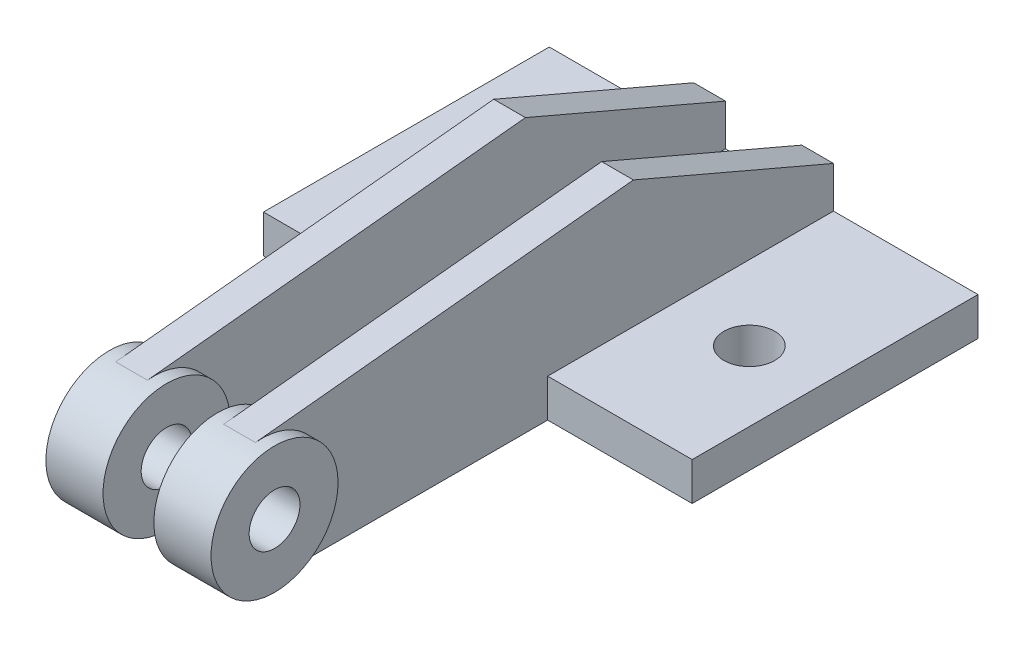
ISO-10303-21;
HEADER;
FILE_DESCRIPTION(('STEP AP214'),'2;1');
FILE_NAME('part.step','',(''),(''),'','','');
FILE_SCHEMA(('AUTOMOTIVE_DESIGN { 1 0 10303 214 1 1 1 1 }'));
ENDSEC;
DATA;
#1=APPLICATION_CONTEXT('core data for automotive mechanical design processes');
#2=APPLICATION_PROTOCOL_DEFINITION('international standard','automotive_design',2000,#1);
#3=PRODUCT_CONTEXT('',#1,'mechanical');
#4=PRODUCT('Part','Part','',(#3));
#5=PRODUCT_RELATED_PRODUCT_CATEGORY('part','',(#4));
#6=PRODUCT_DEFINITION_FORMATION('','',#4);
#7=PRODUCT_DEFINITION_CONTEXT('part definition',#1,'design');
#8=PRODUCT_DEFINITION('design','',#6,#7);
#9=PRODUCT_DEFINITION_SHAPE('','',#8);
#10=(LENGTH_UNIT() NAMED_UNIT(*) SI_UNIT(.MILLI.,.METRE.));
#11=(NAMED_UNIT(*) PLANE_ANGLE_UNIT() SI_UNIT($,.RADIAN.));
#12=(NAMED_UNIT(*) SI_UNIT($,.STERADIAN.) SOLID_ANGLE_UNIT());
#13=UNCERTAINTY_MEASURE_WITH_UNIT(LENGTH_MEASURE(1.E-05),#10,'distance_accuracy_value','');
#14=(GEOMETRIC_REPRESENTATION_CONTEXT(3) GLOBAL_UNCERTAINTY_ASSIGNED_CONTEXT((#13)) GLOBAL_UNIT_ASSIGNED_CONTEXT((#10,
#11,#12)) REPRESENTATION_CONTEXT('',''));
#15=CARTESIAN_POINT('',(0.,0.,0.));
#16=DIRECTION('',(0.,0.,1.));
#17=DIRECTION('',(1.,0.,0.));
#18=AXIS2_PLACEMENT_3D('',#15,#16,#17);
#19=CARTESIAN_POINT('',(-22.,20.,90.));
#20=DIRECTION('',(-1.,0.,0.));
#21=DIRECTION('',(0.,0.,-1.));
#22=AXIS2_PLACEMENT_3D('',#19,#20,#21);
#23=PLANE('',#22);
#24=DIRECTION('',(0.,0.,-1.));
#25=VECTOR('',#24,1.);
#26=CARTESIAN_POINT('',(-22.,0.,0.));
#27=LINE('',#26,#25);
#28=CARTESIAN_POINT('',(-22.,0.,90.));
#29=VERTEX_POINT('',#28);
#30=CARTESIAN_POINT('',(-22.,0.,0.));
#31=VERTEX_POINT('',#30);
#32=EDGE_CURVE('E401',#29,#31,#27,.T.);
#33=ORIENTED_EDGE('',*,*,#32,.F.);
#34=CARTESIAN_POINT('',(-22.,20.,90.));
#35=DIRECTION('',(-1.,0.,0.));
#36=DIRECTION('',(0.,0.,1.));
#37=AXIS2_PLACEMENT_3D('',#34,#35,#36);
#38=CIRCLE('',#37,20.);
#39=CARTESIAN_POINT('',(-22.,39.8974012712608,92.0232208605158));
#40=VERTEX_POINT('',#39);
#41=EDGE_CURVE('E191',#29,#40,#38,.F.);
#42=ORIENTED_EDGE('',*,*,#41,.T.);
#43=DIRECTION('',(0.,-0.10116104302579,0.994870063563043));
#44=VECTOR('',#43,1.);
#45=CARTESIAN_POINT('',(-22.,52.,-27.));
#46=LINE('',#45,#44);
#47=CARTESIAN_POINT('',(-22.,52.,-27.));
#48=VERTEX_POINT('',#47);
#49=EDGE_CURVE('E397',#48,#40,#46,.T.);
#50=ORIENTED_EDGE('',*,*,#49,.F.);
#51=DIRECTION('',(0.,0.393919298579168,0.919145030018058));
#52=VECTOR('',#51,1.);
#53=CARTESIAN_POINT('',(-22.,25.,-90.));
#54=LINE('',#53,#52);
#55=CARTESIAN_POINT('',(-22.,25.,-90.));
#56=VERTEX_POINT('',#55);
#57=EDGE_CURVE('E215',#56,#48,#54,.T.);
#58=ORIENTED_EDGE('',*,*,#57,.F.);
#59=DIRECTION('',(0.,1.,0.));
#60=VECTOR('',#59,1.);
#61=CARTESIAN_POINT('',(-22.,12.,-90.));
#62=LINE('',#61,#60);
#63=CARTESIAN_POINT('',(-22.,12.,-90.));
#64=VERTEX_POINT('',#63);
#65=EDGE_CURVE('E207',#64,#56,#62,.T.);
#66=ORIENTED_EDGE('',*,*,#65,.F.);
#67=DIRECTION('',(0.,0.,-1.));
#68=VECTOR('',#67,1.);
#69=CARTESIAN_POINT('',(-22.,12.,-90.));
#70=LINE('',#69,#68);
#71=CARTESIAN_POINT('',(-22.,12.,0.));
#72=VERTEX_POINT('',#71);
#73=EDGE_CURVE('E374',#72,#64,#70,.T.);
#74=ORIENTED_EDGE('',*,*,#73,.F.);
#75=DIRECTION('',(0.,1.,0.));
#76=VECTOR('',#75,1.);
#77=CARTESIAN_POINT('',(-22.,12.,0.));
#78=LINE('',#77,#76);
#79=EDGE_CURVE('E61',#31,#72,#78,.T.);
#80=ORIENTED_EDGE('',*,*,#79,.F.);
#81=EDGE_LOOP('',(#33,#42,#50,#58,#66,#74,#80));
#82=FACE_BOUND('',#81,.T.);
#83=ADVANCED_FACE('F45',(#82),#23,.T.);
#84=CARTESIAN_POINT('',(-12.,20.,90.));
#85=DIRECTION('',(-1.,0.,0.));
#86=DIRECTION('',(0.,0.,-1.));
#87=AXIS2_PLACEMENT_3D('',#84,#85,#86);
#88=PLANE('',#87);
#89=CARTESIAN_POINT('',(-12.,20.,90.));
#90=DIRECTION('',(-1.,0.,0.));
#91=DIRECTION('',(0.,0.,1.));
#92=AXIS2_PLACEMENT_3D('',#89,#90,#91);
#93=CIRCLE('',#92,20.);
#94=CARTESIAN_POINT('',(-12.,0.,90.));
#95=VERTEX_POINT('',#94);
#96=CARTESIAN_POINT('',(-12.,39.8974012712609,92.0232208605158));
#97=VERTEX_POINT('',#96);
#98=EDGE_CURVE('E11',#95,#97,#93,.F.);
#99=ORIENTED_EDGE('',*,*,#98,.F.);
#100=DIRECTION('',(0.,0.,-1.));
#101=VECTOR('',#100,1.);
#102=CARTESIAN_POINT('',(-12.,0.,0.));
#103=LINE('',#102,#101);
#104=CARTESIAN_POINT('',(-12.,0.,0.));
#105=VERTEX_POINT('',#104);
#106=EDGE_CURVE('E172',#95,#105,#103,.T.);
#107=ORIENTED_EDGE('',*,*,#106,.T.);
#108=DIRECTION('',(0.,1.,0.));
#109=VECTOR('',#108,1.);
#110=CARTESIAN_POINT('',(-12.,12.,0.));
#111=LINE('',#110,#109);
#112=CARTESIAN_POINT('',(-12.,12.,0.));
#113=VERTEX_POINT('',#112);
#114=EDGE_CURVE('E185',#105,#113,#111,.T.);
#115=ORIENTED_EDGE('',*,*,#114,.T.);
#116=DIRECTION('',(0.,0.,-1.));
#117=VECTOR('',#116,1.);
#118=CARTESIAN_POINT('',(-12.,12.,-90.));
#119=LINE('',#118,#117);
#120=CARTESIAN_POINT('',(-12.,12.,-90.));
#121=VERTEX_POINT('',#120);
#122=EDGE_CURVE('E69',#113,#121,#119,.T.);
#123=ORIENTED_EDGE('',*,*,#122,.T.);
#124=DIRECTION('',(0.,1.,0.));
#125=VECTOR('',#124,1.);
#126=CARTESIAN_POINT('',(-12.,12.,-90.));
#127=LINE('',#126,#125);
#128=CARTESIAN_POINT('',(-12.,25.,-90.));
#129=VERTEX_POINT('',#128);
#130=EDGE_CURVE('E365',#121,#129,#127,.T.);
#131=ORIENTED_EDGE('',*,*,#130,.T.);
#132=DIRECTION('',(0.,0.393919298579168,0.919145030018058));
#133=VECTOR('',#132,1.);
#134=CARTESIAN_POINT('',(-12.,25.,-90.));
#135=LINE('',#134,#133);
#136=CARTESIAN_POINT('',(-12.,52.,-27.));
#137=VERTEX_POINT('',#136);
#138=EDGE_CURVE('E202',#129,#137,#135,.T.);
#139=ORIENTED_EDGE('',*,*,#138,.T.);
#140=DIRECTION('',(0.,-0.10116104302579,0.994870063563043));
#141=VECTOR('',#140,1.);
#142=CARTESIAN_POINT('',(-12.,52.,-27.));
#143=LINE('',#142,#141);
#144=EDGE_CURVE('E184',#137,#97,#143,.T.);
#145=ORIENTED_EDGE('',*,*,#144,.T.);
#146=EDGE_LOOP('',(#99,#107,#115,#123,#131,#139,#145));
#147=FACE_BOUND('',#146,.T.);
#148=ADVANCED_FACE('F197',(#147),#88,.F.);
#149=CARTESIAN_POINT('',(67.5,0.,0.));
#150=DIRECTION('',(0.,0.,-1.));
#151=DIRECTION('',(-1.,0.,0.));
#152=AXIS2_PLACEMENT_3D('',#149,#150,#151);
#153=PLANE('',#152);
#154=ORIENTED_EDGE('',*,*,#114,.F.);
#155=DIRECTION('',(-1.,0.,0.));
#156=VECTOR('',#155,1.);
#157=CARTESIAN_POINT('',(67.5,0.,0.));
#158=LINE('',#157,#156);
#159=CARTESIAN_POINT('',(12.,0.,0.));
#160=VERTEX_POINT('',#159);
#161=EDGE_CURVE('E179',#160,#105,#158,.T.);
#162=ORIENTED_EDGE('',*,*,#161,.F.);
#163=DIRECTION('',(0.,1.,0.));
#164=VECTOR('',#163,1.);
#165=CARTESIAN_POINT('',(12.,12.,0.));
#166=LINE('',#165,#164);
#167=CARTESIAN_POINT('',(12.,12.,0.));
#168=VERTEX_POINT('',#167);
#169=EDGE_CURVE('E270',#160,#168,#166,.T.);
#170=ORIENTED_EDGE('',*,*,#169,.T.);
#171=DIRECTION('',(-1.,0.,0.));
#172=VECTOR('',#171,1.);
#173=CARTESIAN_POINT('',(67.5,12.,0.));
#174=LINE('',#173,#172);
#175=EDGE_CURVE('E325',#168,#113,#174,.T.);
#176=ORIENTED_EDGE('',*,*,#175,.T.);
#177=EDGE_LOOP('',(#154,#162,#170,#176));
#178=FACE_BOUND('',#177,.T.);
#179=ADVANCED_FACE('F387',(#178),#153,.F.);
#180=CARTESIAN_POINT('',(67.5,12.,0.));
#181=DIRECTION('',(0.,-1.,0.));
#182=DIRECTION('',(0.,0.,-1.));
#183=AXIS2_PLACEMENT_3D('',#180,#181,#182);
#184=PLANE('',#183);
#185=ORIENTED_EDGE('',*,*,#122,.F.);
#186=ORIENTED_EDGE('',*,*,#175,.F.);
#187=DIRECTION('',(0.,0.,-1.));
#188=VECTOR('',#187,1.);
#189=CARTESIAN_POINT('',(12.,12.,-90.));
#190=LINE('',#189,#188);
#191=CARTESIAN_POINT('',(12.,12.,-90.));
#192=VERTEX_POINT('',#191);
#193=EDGE_CURVE('E237',#168,#192,#190,.T.);
#194=ORIENTED_EDGE('',*,*,#193,.T.);
#195=DIRECTION('',(-1.,0.,0.));
#196=VECTOR('',#195,1.);
#197=CARTESIAN_POINT('',(67.5,12.,-90.));
#198=LINE('',#197,#196);
#199=EDGE_CURVE('E330',#192,#121,#198,.T.);
#200=ORIENTED_EDGE('',*,*,#199,.T.);
#201=EDGE_LOOP('',(#185,#186,#194,#200));
#202=FACE_BOUND('',#201,.T.);
#203=ADVANCED_FACE('F458',(#202),#184,.F.);
#204=CARTESIAN_POINT('',(-67.5,0.,0.));
#205=VERTEX_POINT('',#204);
#206=EDGE_CURVE('E334',#31,#205,#158,.T.);
#207=ORIENTED_EDGE('',*,*,#206,.F.);
#208=ORIENTED_EDGE('',*,*,#79,.T.);
#209=CARTESIAN_POINT('',(-67.5,12.,0.));
#210=VERTEX_POINT('',#209);
#211=EDGE_CURVE('E306',#72,#210,#174,.T.);
#212=ORIENTED_EDGE('',*,*,#211,.T.);
#213=DIRECTION('',(0.,-1.,0.));
#214=VECTOR('',#213,1.);
#215=CARTESIAN_POINT('',(-67.5,0.,0.));
#216=LINE('',#215,#214);
#217=EDGE_CURVE('E291',#210,#205,#216,.T.);
#218=ORIENTED_EDGE('',*,*,#217,.T.);
#219=EDGE_LOOP('',(#207,#208,#212,#218));
#220=FACE_BOUND('',#219,.T.);
#221=ADVANCED_FACE('F383',(#220),#153,.F.);
#222=CARTESIAN_POINT('',(-45.5,12.,-40.));
#223=DIRECTION('',(0.,1.,0.));
#224=DIRECTION('',(0.,0.,1.));
#225=AXIS2_PLACEMENT_3D('',#222,#223,#224);
#226=CIRCLE('',#225,8.00000000000001);
#227=CARTESIAN_POINT('',(-45.5,12.,-32.));
#228=VERTEX_POINT('',#227);
#229=EDGE_CURVE('E448',#228,#228,#226,.T.);
#230=ORIENTED_EDGE('',*,*,#229,.F.);
#231=EDGE_LOOP('',(#230));
#232=FACE_BOUND('',#231,.T.);
#233=ORIENTED_EDGE('',*,*,#211,.F.);
#234=ORIENTED_EDGE('',*,*,#73,.T.);
#235=CARTESIAN_POINT('',(-67.5,12.,-90.));
#236=VERTEX_POINT('',#235);
#237=EDGE_CURVE('E324',#64,#236,#198,.T.);
#238=ORIENTED_EDGE('',*,*,#237,.T.);
#239=DIRECTION('',(0.,0.,1.));
#240=VECTOR('',#239,1.);
#241=CARTESIAN_POINT('',(-67.5,12.,0.));
#242=LINE('',#241,#240);
#243=EDGE_CURVE('E297',#236,#210,#242,.T.);
#244=ORIENTED_EDGE('',*,*,#243,.T.);
#245=EDGE_LOOP('',(#233,#234,#238,#244));
#246=FACE_BOUND('',#245,.T.);
#247=ADVANCED_FACE('F370',(#232,#246),#184,.F.);
#248=CARTESIAN_POINT('',(67.5,12.,0.));
#249=VERTEX_POINT('',#248);
#250=CARTESIAN_POINT('',(22.,12.,0.));
#251=VERTEX_POINT('',#250);
#252=EDGE_CURVE('E320',#249,#251,#174,.T.);
#253=ORIENTED_EDGE('',*,*,#252,.T.);
#254=DIRECTION('',(0.,1.,0.));
#255=VECTOR('',#254,1.);
#256=CARTESIAN_POINT('',(22.,12.,0.));
#257=LINE('',#256,#255);
#258=CARTESIAN_POINT('',(22.,0.,0.));
#259=VERTEX_POINT('',#258);
#260=EDGE_CURVE('E248',#259,#251,#257,.T.);
#261=ORIENTED_EDGE('',*,*,#260,.F.);
#262=CARTESIAN_POINT('',(67.5,0.,0.));
#263=VERTEX_POINT('',#262);
#264=EDGE_CURVE('E335',#263,#259,#158,.T.);
#265=ORIENTED_EDGE('',*,*,#264,.F.);
#266=DIRECTION('',(0.,-1.,0.));
#267=VECTOR('',#266,1.);
#268=CARTESIAN_POINT('',(67.5,0.,0.));
#269=LINE('',#268,#267);
#270=EDGE_CURVE('E292',#249,#263,#269,.T.);
#271=ORIENTED_EDGE('',*,*,#270,.F.);
#272=EDGE_LOOP('',(#253,#261,#265,#271));
#273=FACE_BOUND('',#272,.T.);
#274=ADVANCED_FACE('F47',(#273),#153,.F.);
#275=CARTESIAN_POINT('',(67.5,0.,0.));
#276=DIRECTION('',(0.,1.,0.));
#277=DIRECTION('',(0.,0.,1.));
#278=AXIS2_PLACEMENT_3D('',#275,#276,#277);
#279=PLANE('',#278);
#280=CARTESIAN_POINT('',(-45.5,0.,-40.));
#281=DIRECTION('',(0.,1.,0.));
#282=DIRECTION('',(0.,0.,1.));
#283=AXIS2_PLACEMENT_3D('',#280,#281,#282);
#284=CIRCLE('',#283,8.00000000000001);
#285=CARTESIAN_POINT('',(-45.5,0.,-32.));
#286=VERTEX_POINT('',#285);
#287=EDGE_CURVE('E444',#286,#286,#284,.T.);
#288=ORIENTED_EDGE('',*,*,#287,.T.);
#289=EDGE_LOOP('',(#288));
#290=FACE_BOUND('',#289,.T.);
#291=CARTESIAN_POINT('',(45.5,0.,-40.));
#292=DIRECTION('',(0.,1.,0.));
#293=DIRECTION('',(0.,0.,1.));
#294=AXIS2_PLACEMENT_3D('',#291,#292,#293);
#295=CIRCLE('',#294,8.00000000000001);
#296=CARTESIAN_POINT('',(45.5,0.,-32.));
#297=VERTEX_POINT('',#296);
#298=EDGE_CURVE('E436',#297,#297,#295,.T.);
#299=ORIENTED_EDGE('',*,*,#298,.T.);
#300=EDGE_LOOP('',(#299));
#301=FACE_BOUND('',#300,.T.);
#302=DIRECTION('',(0.,0.,-1.));
#303=VECTOR('',#302,1.);
#304=CARTESIAN_POINT('',(-67.5,0.,0.));
#305=LINE('',#304,#303);
#306=CARTESIAN_POINT('',(-67.5,0.,-90.));
#307=VERTEX_POINT('',#306);
#308=EDGE_CURVE('E310',#205,#307,#305,.T.);
#309=ORIENTED_EDGE('',*,*,#308,.T.);
#310=DIRECTION('',(-1.,0.,0.));
#311=VECTOR('',#310,1.);
#312=CARTESIAN_POINT('',(67.5,0.,-90.));
#313=LINE('',#312,#311);
#314=CARTESIAN_POINT('',(67.5,0.,-90.));
#315=VERTEX_POINT('',#314);
#316=EDGE_CURVE('E329',#315,#307,#313,.T.);
#317=ORIENTED_EDGE('',*,*,#316,.F.);
#318=DIRECTION('',(0.,0.,-1.));
#319=VECTOR('',#318,1.);
#320=CARTESIAN_POINT('',(67.5,0.,0.));
#321=LINE('',#320,#319);
#322=EDGE_CURVE('E296',#263,#315,#321,.T.);
#323=ORIENTED_EDGE('',*,*,#322,.F.);
#324=ORIENTED_EDGE('',*,*,#264,.T.);
#325=DIRECTION('',(0.,0.,-1.));
#326=VECTOR('',#325,1.);
#327=CARTESIAN_POINT('',(22.,0.,0.));
#328=LINE('',#327,#326);
#329=CARTESIAN_POINT('',(22.,0.,90.));
#330=VERTEX_POINT('',#329);
#331=EDGE_CURVE('E244',#330,#259,#328,.T.);
#332=ORIENTED_EDGE('',*,*,#331,.F.);
#333=DIRECTION('',(-1.,0.,0.));
#334=VECTOR('',#333,1.);
#335=CARTESIAN_POINT('',(22.,0.,90.));
#336=LINE('',#335,#334);
#337=CARTESIAN_POINT('',(12.,0.,90.));
#338=VERTEX_POINT('',#337);
#339=EDGE_CURVE('E256',#330,#338,#336,.T.);
#340=ORIENTED_EDGE('',*,*,#339,.T.);
#341=DIRECTION('',(0.,0.,-1.));
#342=VECTOR('',#341,1.);
#343=CARTESIAN_POINT('',(12.,0.,0.));
#344=LINE('',#343,#342);
#345=EDGE_CURVE('E267',#338,#160,#344,.T.);
#346=ORIENTED_EDGE('',*,*,#345,.T.);
#347=ORIENTED_EDGE('',*,*,#161,.T.);
#348=ORIENTED_EDGE('',*,*,#106,.F.);
#349=DIRECTION('',(1.,0.,0.));
#350=VECTOR('',#349,1.);
#351=CARTESIAN_POINT('',(-22.,0.,90.));
#352=LINE('',#351,#350);
#353=EDGE_CURVE('E176',#29,#95,#352,.T.);
#354=ORIENTED_EDGE('',*,*,#353,.F.);
#355=ORIENTED_EDGE('',*,*,#32,.T.);
#356=ORIENTED_EDGE('',*,*,#206,.T.);
#357=EDGE_LOOP('',(#309,#317,#323,#324,#332,#340,#346,#347,#348,#354,#355,#356));
#358=FACE_BOUND('',#357,.T.);
#359=ADVANCED_FACE('F174',(#290,#301,#358),#279,.F.);
#360=CARTESIAN_POINT('',(67.5,0.,-90.));
#361=DIRECTION('',(0.,0.,1.));
#362=DIRECTION('',(1.,0.,0.));
#363=AXIS2_PLACEMENT_3D('',#360,#361,#362);
#364=PLANE('',#363);
#365=DIRECTION('',(0.,1.,0.));
#366=VECTOR('',#365,1.);
#367=CARTESIAN_POINT('',(-67.5,0.,-90.));
#368=LINE('',#367,#366);
#369=EDGE_CURVE('E313',#307,#236,#368,.T.);
#370=ORIENTED_EDGE('',*,*,#369,.T.);
#371=ORIENTED_EDGE('',*,*,#237,.F.);
#372=ORIENTED_EDGE('',*,*,#65,.T.);
#373=DIRECTION('',(1.,0.,0.));
#374=VECTOR('',#373,1.);
#375=CARTESIAN_POINT('',(-22.,25.,-90.));
#376=LINE('',#375,#374);
#377=EDGE_CURVE('E211',#56,#129,#376,.T.);
#378=ORIENTED_EDGE('',*,*,#377,.T.);
#379=ORIENTED_EDGE('',*,*,#130,.F.);
#380=ORIENTED_EDGE('',*,*,#199,.F.);
#381=DIRECTION('',(0.,1.,0.));
#382=VECTOR('',#381,1.);
#383=CARTESIAN_POINT('',(12.,12.,-90.));
#384=LINE('',#383,#382);
#385=CARTESIAN_POINT('',(12.,25.,-90.));
#386=VERTEX_POINT('',#385);
#387=EDGE_CURVE('E231',#192,#386,#384,.T.);
#388=ORIENTED_EDGE('',*,*,#387,.T.);
#389=DIRECTION('',(-1.,0.,0.));
#390=VECTOR('',#389,1.);
#391=CARTESIAN_POINT('',(22.,25.,-90.));
#392=LINE('',#391,#390);
#393=CARTESIAN_POINT('',(22.,25.,-90.));
#394=VERTEX_POINT('',#393);
#395=EDGE_CURVE('E287',#394,#386,#392,.T.);
#396=ORIENTED_EDGE('',*,*,#395,.F.);
#397=DIRECTION('',(0.,1.,0.));
#398=VECTOR('',#397,1.);
#399=CARTESIAN_POINT('',(22.,12.,-90.));
#400=LINE('',#399,#398);
#401=CARTESIAN_POINT('',(22.,12.,-90.));
#402=VERTEX_POINT('',#401);
#403=EDGE_CURVE('E232',#402,#394,#400,.T.);
#404=ORIENTED_EDGE('',*,*,#403,.F.);
#405=CARTESIAN_POINT('',(67.5,12.,-90.));
#406=VERTEX_POINT('',#405);
#407=EDGE_CURVE('E326',#406,#402,#198,.T.);
#408=ORIENTED_EDGE('',*,*,#407,.F.);
#409=DIRECTION('',(0.,1.,0.));
#410=VECTOR('',#409,1.);
#411=CARTESIAN_POINT('',(67.5,0.,-90.));
#412=LINE('',#411,#410);
#413=EDGE_CURVE('E300',#315,#406,#412,.T.);
#414=ORIENTED_EDGE('',*,*,#413,.F.);
#415=ORIENTED_EDGE('',*,*,#316,.T.);
#416=EDGE_LOOP('',(#370,#371,#372,#378,#379,#380,#388,#396,#404,#408,#414,#415));
#417=FACE_BOUND('',#416,.T.);
#418=ADVANCED_FACE('F363',(#417),#364,.F.);
#419=CARTESIAN_POINT('',(45.5,12.,-40.));
#420=DIRECTION('',(0.,1.,0.));
#421=DIRECTION('',(0.,0.,1.));
#422=AXIS2_PLACEMENT_3D('',#419,#420,#421);
#423=CIRCLE('',#422,8.00000000000001);
#424=CARTESIAN_POINT('',(45.5,12.,-32.));
#425=VERTEX_POINT('',#424);
#426=EDGE_CURVE('E440',#425,#425,#423,.T.);
#427=ORIENTED_EDGE('',*,*,#426,.F.);
#428=EDGE_LOOP('',(#427));
#429=FACE_BOUND('',#428,.T.);
#430=ORIENTED_EDGE('',*,*,#407,.T.);
#431=DIRECTION('',(0.,0.,-1.));
#432=VECTOR('',#431,1.);
#433=CARTESIAN_POINT('',(22.,12.,-90.));
#434=LINE('',#433,#432);
#435=EDGE_CURVE('E252',#251,#402,#434,.T.);
#436=ORIENTED_EDGE('',*,*,#435,.F.);
#437=ORIENTED_EDGE('',*,*,#252,.F.);
#438=DIRECTION('',(0.,0.,1.));
#439=VECTOR('',#438,1.);
#440=CARTESIAN_POINT('',(67.5,12.,0.));
#441=LINE('',#440,#439);
#442=EDGE_CURVE('E303',#406,#249,#441,.T.);
#443=ORIENTED_EDGE('',*,*,#442,.F.);
#444=EDGE_LOOP('',(#430,#436,#437,#443));
#445=FACE_BOUND('',#444,.T.);
#446=ADVANCED_FACE('F457',(#429,#445),#184,.F.);
#447=CARTESIAN_POINT('',(67.5,0.,0.));
#448=DIRECTION('',(-1.,0.,0.));
#449=DIRECTION('',(0.,0.,1.));
#450=AXIS2_PLACEMENT_3D('',#447,#448,#449);
#451=PLANE('',#450);
#452=ORIENTED_EDGE('',*,*,#270,.T.);
#453=ORIENTED_EDGE('',*,*,#322,.T.);
#454=ORIENTED_EDGE('',*,*,#413,.T.);
#455=ORIENTED_EDGE('',*,*,#442,.T.);
#456=EDGE_LOOP('',(#452,#453,#454,#455));
#457=FACE_BOUND('',#456,.T.);
#458=ADVANCED_FACE('F469',(#457),#451,.F.);
#459=CARTESIAN_POINT('',(-67.5,0.,0.));
#460=DIRECTION('',(-1.,0.,0.));
#461=DIRECTION('',(0.,0.,1.));
#462=AXIS2_PLACEMENT_3D('',#459,#460,#461);
#463=PLANE('',#462);
#464=ORIENTED_EDGE('',*,*,#217,.F.);
#465=ORIENTED_EDGE('',*,*,#243,.F.);
#466=ORIENTED_EDGE('',*,*,#369,.F.);
#467=ORIENTED_EDGE('',*,*,#308,.F.);
#468=EDGE_LOOP('',(#464,#465,#466,#467));
#469=FACE_BOUND('',#468,.T.);
#470=ADVANCED_FACE('F382',(#469),#463,.T.);
#471=CARTESIAN_POINT('',(22.,25.,-90.));
#472=DIRECTION('',(0.,-0.919145030018058,0.393919298579168));
#473=DIRECTION('',(0.,-0.393919298579168,-0.919145030018058));
#474=AXIS2_PLACEMENT_3D('',#471,#472,#473);
#475=PLANE('',#474);
#476=DIRECTION('',(0.,0.393919298579168,0.919145030018058));
#477=VECTOR('',#476,1.);
#478=CARTESIAN_POINT('',(12.,25.,-90.));
#479=LINE('',#478,#477);
#480=CARTESIAN_POINT('',(12.,52.,-27.));
#481=VERTEX_POINT('',#480);
#482=EDGE_CURVE('E260',#386,#481,#479,.T.);
#483=ORIENTED_EDGE('',*,*,#482,.T.);
#484=DIRECTION('',(-1.,0.,0.));
#485=VECTOR('',#484,1.);
#486=CARTESIAN_POINT('',(22.,52.,-27.));
#487=LINE('',#486,#485);
#488=CARTESIAN_POINT('',(22.,52.,-27.));
#489=VERTEX_POINT('',#488);
#490=EDGE_CURVE('E283',#489,#481,#487,.T.);
#491=ORIENTED_EDGE('',*,*,#490,.F.);
#492=DIRECTION('',(0.,0.393919298579168,0.919145030018058));
#493=VECTOR('',#492,1.);
#494=CARTESIAN_POINT('',(22.,25.,-90.));
#495=LINE('',#494,#493);
#496=EDGE_CURVE('E236',#394,#489,#495,.T.);
#497=ORIENTED_EDGE('',*,*,#496,.F.);
#498=ORIENTED_EDGE('',*,*,#395,.T.);
#499=EDGE_LOOP('',(#483,#491,#497,#498));
#500=FACE_BOUND('',#499,.T.);
#501=ADVANCED_FACE('F358',(#500),#475,.F.);
#502=CARTESIAN_POINT('',(22.,52.,-27.));
#503=DIRECTION('',(0.,-0.994870063563044,-0.10116104302579));
#504=DIRECTION('',(0.,0.10116104302579,-0.994870063563044));
#505=AXIS2_PLACEMENT_3D('',#502,#503,#504);
#506=PLANE('',#505);
#507=DIRECTION('',(0.,-0.10116104302579,0.994870063563043));
#508=VECTOR('',#507,1.);
#509=CARTESIAN_POINT('',(12.,52.,-27.));
#510=LINE('',#509,#508);
#511=CARTESIAN_POINT('',(12.,39.8974012712609,92.0232208605158));
#512=VERTEX_POINT('',#511);
#513=EDGE_CURVE('E263',#481,#512,#510,.T.);
#514=ORIENTED_EDGE('',*,*,#513,.T.);
#515=DIRECTION('',(-1.,0.,0.));
#516=VECTOR('',#515,1.);
#517=CARTESIAN_POINT('',(22.,39.8974012712609,92.0232208605158));
#518=LINE('',#517,#516);
#519=CARTESIAN_POINT('',(22.,39.8974012712608,92.0232208605158));
#520=VERTEX_POINT('',#519);
#521=EDGE_CURVE('E279',#520,#512,#518,.T.);
#522=ORIENTED_EDGE('',*,*,#521,.F.);
#523=DIRECTION('',(0.,-0.10116104302579,0.994870063563043));
#524=VECTOR('',#523,1.);
#525=CARTESIAN_POINT('',(22.,52.,-27.));
#526=LINE('',#525,#524);
#527=EDGE_CURVE('E240',#489,#520,#526,.T.);
#528=ORIENTED_EDGE('',*,*,#527,.F.);
#529=ORIENTED_EDGE('',*,*,#490,.T.);
#530=EDGE_LOOP('',(#514,#522,#528,#529));
#531=FACE_BOUND('',#530,.T.);
#532=ADVANCED_FACE('F347',(#531),#506,.F.);
#533=CARTESIAN_POINT('',(22.,20.,90.));
#534=DIRECTION('',(-1.,0.,0.));
#535=DIRECTION('',(0.,0.,1.));
#536=AXIS2_PLACEMENT_3D('',#533,#534,#535);
#537=CYLINDRICAL_SURFACE('',#536,20.);
#538=ORIENTED_EDGE('',*,*,#521,.T.);
#539=CARTESIAN_POINT('',(12.,20.,90.));
#540=DIRECTION('',(1.,0.,0.));
#541=DIRECTION('',(0.,0.,-1.));
#542=AXIS2_PLACEMENT_3D('',#539,#540,#541);
#543=CIRCLE('',#542,20.);
#544=EDGE_CURVE('E54',#338,#512,#543,.T.);
#545=ORIENTED_EDGE('',*,*,#544,.F.);
#546=ORIENTED_EDGE('',*,*,#339,.F.);
#547=CARTESIAN_POINT('',(22.,20.,90.));
#548=DIRECTION('',(1.,0.,0.));
#549=DIRECTION('',(0.,0.,-1.));
#550=AXIS2_PLACEMENT_3D('',#547,#548,#549);
#551=CIRCLE('',#550,20.);
#552=EDGE_CURVE('E227',#330,#520,#551,.T.);
#553=ORIENTED_EDGE('',*,*,#552,.T.);
#554=EDGE_LOOP('',(#538,#545,#546,#553));
#555=FACE_BOUND('',#554,.T.);
#556=CARTESIAN_POINT('',(8.,20.,90.));
#557=DIRECTION('',(1.,0.,0.));
#558=DIRECTION('',(0.,0.,-1.));
#559=AXIS2_PLACEMENT_3D('',#556,#557,#558);
#560=CIRCLE('',#559,20.);
#561=CARTESIAN_POINT('',(8.,20.,70.));
#562=VERTEX_POINT('',#561);
#563=EDGE_CURVE('E223',#562,#562,#560,.T.);
#564=ORIENTED_EDGE('',*,*,#563,.T.);
#565=EDGE_LOOP('',(#564));
#566=FACE_BOUND('',#565,.T.);
#567=CARTESIAN_POINT('',(26.,20.,90.));
#568=DIRECTION('',(1.,0.,0.));
#569=DIRECTION('',(0.,0.,-1.));
#570=AXIS2_PLACEMENT_3D('',#567,#568,#569);
#571=CIRCLE('',#570,20.);
#572=CARTESIAN_POINT('',(26.,20.,70.));
#573=VERTEX_POINT('',#572);
#574=EDGE_CURVE('E193',#573,#573,#571,.T.);
#575=ORIENTED_EDGE('',*,*,#574,.F.);
#576=EDGE_LOOP('',(#575));
#577=FACE_BOUND('',#576,.T.);
#578=ADVANCED_FACE('F350',(#555,#566,#577),#537,.T.);
#579=CARTESIAN_POINT('',(22.,20.,90.));
#580=DIRECTION('',(1.,0.,0.));
#581=DIRECTION('',(0.,0.,-1.));
#582=AXIS2_PLACEMENT_3D('',#579,#580,#581);
#583=PLANE('',#582);
#584=ORIENTED_EDGE('',*,*,#552,.F.);
#585=ORIENTED_EDGE('',*,*,#331,.T.);
#586=ORIENTED_EDGE('',*,*,#260,.T.);
#587=ORIENTED_EDGE('',*,*,#435,.T.);
#588=ORIENTED_EDGE('',*,*,#403,.T.);
#589=ORIENTED_EDGE('',*,*,#496,.T.);
#590=ORIENTED_EDGE('',*,*,#527,.T.);
#591=EDGE_LOOP('',(#584,#585,#586,#587,#588,#589,#590));
#592=FACE_BOUND('',#591,.T.);
#593=ADVANCED_FACE('F354',(#592),#583,.T.);
#594=CARTESIAN_POINT('',(12.,20.,90.));
#595=DIRECTION('',(1.,0.,0.));
#596=DIRECTION('',(0.,0.,-1.));
#597=AXIS2_PLACEMENT_3D('',#594,#595,#596);
#598=PLANE('',#597);
#599=ORIENTED_EDGE('',*,*,#345,.F.);
#600=ORIENTED_EDGE('',*,*,#544,.T.);
#601=ORIENTED_EDGE('',*,*,#513,.F.);
#602=ORIENTED_EDGE('',*,*,#482,.F.);
#603=ORIENTED_EDGE('',*,*,#387,.F.);
#604=ORIENTED_EDGE('',*,*,#193,.F.);
#605=ORIENTED_EDGE('',*,*,#169,.F.);
#606=EDGE_LOOP('',(#599,#600,#601,#602,#603,#604,#605));
#607=FACE_BOUND('',#606,.T.);
#608=ADVANCED_FACE('F342',(#607),#598,.F.);
#609=CARTESIAN_POINT('',(8.,20.,90.));
#610=DIRECTION('',(1.,0.,0.));
#611=DIRECTION('',(0.,0.,-1.));
#612=AXIS2_PLACEMENT_3D('',#609,#610,#611);
#613=PLANE('',#612);
#614=CARTESIAN_POINT('',(8.,20.,90.));
#615=DIRECTION('',(1.,0.,0.));
#616=DIRECTION('',(0.,0.,-1.));
#617=AXIS2_PLACEMENT_3D('',#614,#615,#616);
#618=CIRCLE('',#617,8.00000000000001);
#619=CARTESIAN_POINT('',(8.,20.,82.));
#620=VERTEX_POINT('',#619);
#621=EDGE_CURVE('E424',#620,#620,#618,.T.);
#622=ORIENTED_EDGE('',*,*,#621,.T.);
#623=EDGE_LOOP('',(#622));
#624=FACE_BOUND('',#623,.T.);
#625=ORIENTED_EDGE('',*,*,#563,.F.);
#626=EDGE_LOOP('',(#625));
#627=FACE_BOUND('',#626,.T.);
#628=ADVANCED_FACE('F496',(#624,#627),#613,.F.);
#629=CARTESIAN_POINT('',(26.,20.,90.));
#630=DIRECTION('',(1.,0.,0.));
#631=DIRECTION('',(0.,0.,-1.));
#632=AXIS2_PLACEMENT_3D('',#629,#630,#631);
#633=PLANE('',#632);
#634=CARTESIAN_POINT('',(26.,20.,90.));
#635=DIRECTION('',(1.,0.,0.));
#636=DIRECTION('',(0.,0.,-1.));
#637=AXIS2_PLACEMENT_3D('',#634,#635,#636);
#638=CIRCLE('',#637,8.00000000000001);
#639=CARTESIAN_POINT('',(26.,20.,82.));
#640=VERTEX_POINT('',#639);
#641=EDGE_CURVE('E432',#640,#640,#638,.T.);
#642=ORIENTED_EDGE('',*,*,#641,.F.);
#643=EDGE_LOOP('',(#642));
#644=FACE_BOUND('',#643,.T.);
#645=ORIENTED_EDGE('',*,*,#574,.T.);
#646=EDGE_LOOP('',(#645));
#647=FACE_BOUND('',#646,.T.);
#648=ADVANCED_FACE('F493',(#644,#647),#633,.T.);
#649=CARTESIAN_POINT('',(-22.,20.,90.));
#650=DIRECTION('',(1.,0.,0.));
#651=DIRECTION('',(0.,0.,-1.));
#652=AXIS2_PLACEMENT_3D('',#649,#650,#651);
#653=CYLINDRICAL_SURFACE('',#652,20.);
#654=ORIENTED_EDGE('',*,*,#353,.T.);
#655=ORIENTED_EDGE('',*,*,#98,.T.);
#656=DIRECTION('',(1.,0.,0.));
#657=VECTOR('',#656,1.);
#658=CARTESIAN_POINT('',(-22.,39.8974012712609,92.0232208605158));
#659=LINE('',#658,#657);
#660=EDGE_CURVE('E194',#40,#97,#659,.T.);
#661=ORIENTED_EDGE('',*,*,#660,.F.);
#662=ORIENTED_EDGE('',*,*,#41,.F.);
#663=EDGE_LOOP('',(#654,#655,#661,#662));
#664=FACE_BOUND('',#663,.T.);
#665=CARTESIAN_POINT('',(-8.,20.,90.));
#666=DIRECTION('',(1.,0.,0.));
#667=DIRECTION('',(0.,0.,-1.));
#668=AXIS2_PLACEMENT_3D('',#665,#666,#667);
#669=CIRCLE('',#668,20.);
#670=CARTESIAN_POINT('',(-8.,20.,70.));
#671=VERTEX_POINT('',#670);
#672=EDGE_CURVE('E412',#671,#671,#669,.T.);
#673=ORIENTED_EDGE('',*,*,#672,.F.);
#674=EDGE_LOOP('',(#673));
#675=FACE_BOUND('',#674,.T.);
#676=CARTESIAN_POINT('',(-26.,20.,90.));
#677=DIRECTION('',(1.,0.,0.));
#678=DIRECTION('',(0.,0.,-1.));
#679=AXIS2_PLACEMENT_3D('',#676,#677,#678);
#680=CIRCLE('',#679,20.);
#681=CARTESIAN_POINT('',(-26.,20.,70.));
#682=VERTEX_POINT('',#681);
#683=EDGE_CURVE('E416',#682,#682,#680,.T.);
#684=ORIENTED_EDGE('',*,*,#683,.T.);
#685=EDGE_LOOP('',(#684));
#686=FACE_BOUND('',#685,.T.);
#687=ADVANCED_FACE('F188',(#664,#675,#686),#653,.T.);
#688=CARTESIAN_POINT('',(-22.,52.,-27.));
#689=DIRECTION('',(0.,0.994870063563044,0.10116104302579));
#690=DIRECTION('',(0.,-0.10116104302579,0.994870063563044));
#691=AXIS2_PLACEMENT_3D('',#688,#689,#690);
#692=PLANE('',#691);
#693=ORIENTED_EDGE('',*,*,#144,.F.);
#694=DIRECTION('',(1.,0.,0.));
#695=VECTOR('',#694,1.);
#696=CARTESIAN_POINT('',(-22.,52.,-27.));
#697=LINE('',#696,#695);
#698=EDGE_CURVE('E214',#48,#137,#697,.T.);
#699=ORIENTED_EDGE('',*,*,#698,.F.);
#700=ORIENTED_EDGE('',*,*,#49,.T.);
#701=ORIENTED_EDGE('',*,*,#660,.T.);
#702=EDGE_LOOP('',(#693,#699,#700,#701));
#703=FACE_BOUND('',#702,.T.);
#704=ADVANCED_FACE('F487',(#703),#692,.T.);
#705=CARTESIAN_POINT('',(-22.,25.,-90.));
#706=DIRECTION('',(0.,0.919145030018058,-0.393919298579168));
#707=DIRECTION('',(0.,0.393919298579168,0.919145030018058));
#708=AXIS2_PLACEMENT_3D('',#705,#706,#707);
#709=PLANE('',#708);
#710=ORIENTED_EDGE('',*,*,#138,.F.);
#711=ORIENTED_EDGE('',*,*,#377,.F.);
#712=ORIENTED_EDGE('',*,*,#57,.T.);
#713=ORIENTED_EDGE('',*,*,#698,.T.);
#714=EDGE_LOOP('',(#710,#711,#712,#713));
#715=FACE_BOUND('',#714,.T.);
#716=ADVANCED_FACE('F484',(#715),#709,.T.);
#717=CARTESIAN_POINT('',(-8.,20.,90.));
#718=DIRECTION('',(-1.,0.,0.));
#719=DIRECTION('',(0.,0.,-1.));
#720=AXIS2_PLACEMENT_3D('',#717,#718,#719);
#721=PLANE('',#720);
#722=CARTESIAN_POINT('',(-8.,20.,90.));
#723=DIRECTION('',(-1.,0.,0.));
#724=DIRECTION('',(0.,0.,1.));
#725=AXIS2_PLACEMENT_3D('',#722,#723,#724);
#726=CIRCLE('',#725,8.00000000000001);
#727=CARTESIAN_POINT('',(-8.,20.,98.));
#728=VERTEX_POINT('',#727);
#729=EDGE_CURVE('E420',#728,#728,#726,.T.);
#730=ORIENTED_EDGE('',*,*,#729,.T.);
#731=EDGE_LOOP('',(#730));
#732=FACE_BOUND('',#731,.T.);
#733=ORIENTED_EDGE('',*,*,#672,.T.);
#734=EDGE_LOOP('',(#733));
#735=FACE_BOUND('',#734,.T.);
#736=ADVANCED_FACE('F481',(#732,#735),#721,.F.);
#737=CARTESIAN_POINT('',(-26.,20.,90.));
#738=DIRECTION('',(-1.,0.,0.));
#739=DIRECTION('',(0.,0.,-1.));
#740=AXIS2_PLACEMENT_3D('',#737,#738,#739);
#741=PLANE('',#740);
#742=CARTESIAN_POINT('',(-26.,20.,90.));
#743=DIRECTION('',(-1.,0.,0.));
#744=DIRECTION('',(0.,0.,1.));
#745=AXIS2_PLACEMENT_3D('',#742,#743,#744);
#746=CIRCLE('',#745,8.00000000000001);
#747=CARTESIAN_POINT('',(-26.,20.,98.));
#748=VERTEX_POINT('',#747);
#749=EDGE_CURVE('E428',#748,#748,#746,.T.);
#750=ORIENTED_EDGE('',*,*,#749,.F.);
#751=EDGE_LOOP('',(#750));
#752=FACE_BOUND('',#751,.T.);
#753=ORIENTED_EDGE('',*,*,#683,.F.);
#754=EDGE_LOOP('',(#753));
#755=FACE_BOUND('',#754,.T.);
#756=ADVANCED_FACE('F610',(#752,#755),#741,.T.);
#757=CARTESIAN_POINT('',(26.,20.,90.));
#758=DIRECTION('',(1.,0.,0.));
#759=DIRECTION('',(0.,0.,-1.));
#760=AXIS2_PLACEMENT_3D('',#757,#758,#759);
#761=CYLINDRICAL_SURFACE('',#760,8.00000000000001);
#762=ORIENTED_EDGE('',*,*,#641,.T.);
#763=EDGE_LOOP('',(#762));
#764=FACE_BOUND('',#763,.T.);
#765=ORIENTED_EDGE('',*,*,#621,.F.);
#766=EDGE_LOOP('',(#765));
#767=FACE_BOUND('',#766,.T.);
#768=ADVANCED_FACE('F618',(#764,#767),#761,.F.);
#769=ORIENTED_EDGE('',*,*,#749,.T.);
#770=EDGE_LOOP('',(#769));
#771=FACE_BOUND('',#770,.T.);
#772=ORIENTED_EDGE('',*,*,#729,.F.);
#773=EDGE_LOOP('',(#772));
#774=FACE_BOUND('',#773,.T.);
#775=ADVANCED_FACE('F626',(#771,#774),#761,.F.);
#776=CARTESIAN_POINT('',(45.5,12.,-40.));
#777=DIRECTION('',(0.,1.,0.));
#778=DIRECTION('',(0.,0.,1.));
#779=AXIS2_PLACEMENT_3D('',#776,#777,#778);
#780=CYLINDRICAL_SURFACE('',#779,8.00000000000001);
#781=ORIENTED_EDGE('',*,*,#298,.F.);
#782=EDGE_LOOP('',(#781));
#783=FACE_BOUND('',#782,.T.);
#784=ORIENTED_EDGE('',*,*,#426,.T.);
#785=EDGE_LOOP('',(#784));
#786=FACE_BOUND('',#785,.T.);
#787=ADVANCED_FACE('F635',(#783,#786),#780,.F.);
#788=CARTESIAN_POINT('',(-45.5,12.,-40.));
#789=DIRECTION('',(0.,1.,0.));
#790=DIRECTION('',(0.,0.,1.));
#791=AXIS2_PLACEMENT_3D('',#788,#789,#790);
#792=CYLINDRICAL_SURFACE('',#791,8.00000000000001);
#793=ORIENTED_EDGE('',*,*,#287,.F.);
#794=EDGE_LOOP('',(#793));
#795=FACE_BOUND('',#794,.T.);
#796=ORIENTED_EDGE('',*,*,#229,.T.);
#797=EDGE_LOOP('',(#796));
#798=FACE_BOUND('',#797,.T.);
#799=ADVANCED_FACE('F453',(#795,#798),#792,.F.);
#800=CLOSED_SHELL('',(#83,#148,#179,#203,#221,#247,#274,#359,#418,#446,#458,#470,#501,#532,#578,
#593,#608,#628,#648,#687,#704,#716,#736,#756,#768,#775,#787,#799));
#801=MANIFOLD_SOLID_BREP('B2',#800);
#802=ADVANCED_BREP_SHAPE_REPRESENTATION('',(#18,#801),#14);
#803=SHAPE_DEFINITION_REPRESENTATION(#9,#802);
ENDSEC;
END-ISO-10303-21;
